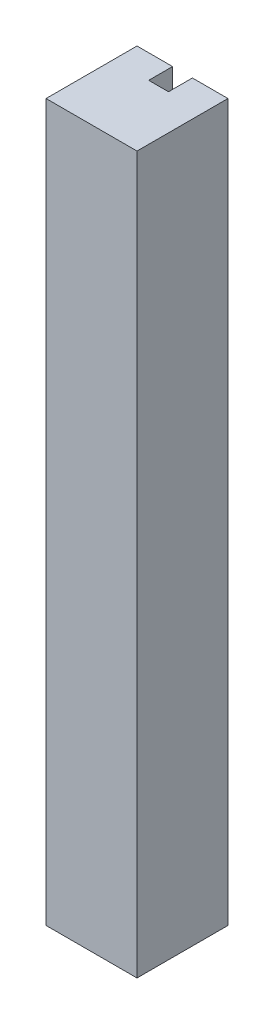
ISO-10303-21;
HEADER;
FILE_DESCRIPTION(('STEP AP214'),'2;1');
FILE_NAME('part.step','',(''),(''),'','','');
FILE_SCHEMA(('AUTOMOTIVE_DESIGN { 1 0 10303 214 1 1 1 1 }'));
ENDSEC;
DATA;
#1=APPLICATION_CONTEXT('core data for automotive mechanical design processes');
#2=APPLICATION_PROTOCOL_DEFINITION('international standard','automotive_design',2000,#1);
#3=PRODUCT_CONTEXT('',#1,'mechanical');
#4=PRODUCT('Part','Part','',(#3));
#5=PRODUCT_RELATED_PRODUCT_CATEGORY('part','',(#4));
#6=PRODUCT_DEFINITION_FORMATION('','',#4);
#7=PRODUCT_DEFINITION_CONTEXT('part definition',#1,'design');
#8=PRODUCT_DEFINITION('design','',#6,#7);
#9=PRODUCT_DEFINITION_SHAPE('','',#8);
#10=(LENGTH_UNIT() NAMED_UNIT(*) SI_UNIT(.MILLI.,.METRE.));
#11=(NAMED_UNIT(*) PLANE_ANGLE_UNIT() SI_UNIT($,.RADIAN.));
#12=(NAMED_UNIT(*) SI_UNIT($,.STERADIAN.) SOLID_ANGLE_UNIT());
#13=UNCERTAINTY_MEASURE_WITH_UNIT(LENGTH_MEASURE(1.E-05),#10,'distance_accuracy_value','');
#14=(GEOMETRIC_REPRESENTATION_CONTEXT(3) GLOBAL_UNCERTAINTY_ASSIGNED_CONTEXT((#13)) GLOBAL_UNIT_ASSIGNED_CONTEXT((#10,
#11,#12)) REPRESENTATION_CONTEXT('',''));
#15=CARTESIAN_POINT('',(0.,0.,0.));
#16=DIRECTION('',(0.,0.,1.));
#17=DIRECTION('',(1.,0.,0.));
#18=AXIS2_PLACEMENT_3D('',#15,#16,#17);
#19=CARTESIAN_POINT('',(38.1,300.,0.));
#20=DIRECTION('',(0.,0.,-1.));
#21=DIRECTION('',(-1.,0.,0.));
#22=AXIS2_PLACEMENT_3D('',#19,#20,#21);
#23=PLANE('',#22);
#24=DIRECTION('',(1.,0.,0.));
#25=VECTOR('',#24,1.);
#26=CARTESIAN_POINT('',(38.1,0.,0.));
#27=LINE('',#26,#25);
#28=CARTESIAN_POINT('',(0.,0.,0.));
#29=VERTEX_POINT('',#28);
#30=CARTESIAN_POINT('',(38.1,0.,0.));
#31=VERTEX_POINT('',#30);
#32=EDGE_CURVE('E134',#29,#31,#27,.T.);
#33=ORIENTED_EDGE('',*,*,#32,.T.);
#34=DIRECTION('',(0.,-1.,0.));
#35=VECTOR('',#34,1.);
#36=CARTESIAN_POINT('',(38.1,300.,0.));
#37=LINE('',#36,#35);
#38=CARTESIAN_POINT('',(38.1,300.,0.));
#39=VERTEX_POINT('',#38);
#40=EDGE_CURVE('E11',#39,#31,#37,.T.);
#41=ORIENTED_EDGE('',*,*,#40,.F.);
#42=DIRECTION('',(1.,0.,0.));
#43=VECTOR('',#42,1.);
#44=CARTESIAN_POINT('',(38.1,300.,0.));
#45=LINE('',#44,#43);
#46=CARTESIAN_POINT('',(0.,300.,0.));
#47=VERTEX_POINT('',#46);
#48=EDGE_CURVE('E148',#47,#39,#45,.T.);
#49=ORIENTED_EDGE('',*,*,#48,.F.);
#50=DIRECTION('',(0.,-1.,0.));
#51=VECTOR('',#50,1.);
#52=CARTESIAN_POINT('',(0.,300.,0.));
#53=LINE('',#52,#51);
#54=EDGE_CURVE('E130',#47,#29,#53,.T.);
#55=ORIENTED_EDGE('',*,*,#54,.T.);
#56=EDGE_LOOP('',(#33,#41,#49,#55));
#57=FACE_BOUND('',#56,.T.);
#58=ADVANCED_FACE('F38',(#57),#23,.F.);
#59=CARTESIAN_POINT('',(38.1,300.,-38.1));
#60=DIRECTION('',(-1.,0.,0.));
#61=DIRECTION('',(0.,0.,1.));
#62=AXIS2_PLACEMENT_3D('',#59,#60,#61);
#63=PLANE('',#62);
#64=DIRECTION('',(0.,0.,-1.));
#65=VECTOR('',#64,1.);
#66=CARTESIAN_POINT('',(38.1,0.,-38.1));
#67=LINE('',#66,#65);
#68=CARTESIAN_POINT('',(38.1,0.,-38.1));
#69=VERTEX_POINT('',#68);
#70=EDGE_CURVE('E137',#31,#69,#67,.T.);
#71=ORIENTED_EDGE('',*,*,#70,.T.);
#72=DIRECTION('',(0.,-1.,0.));
#73=VECTOR('',#72,1.);
#74=CARTESIAN_POINT('',(38.1,300.,-38.1));
#75=LINE('',#74,#73);
#76=CARTESIAN_POINT('',(38.1,300.,-38.1));
#77=VERTEX_POINT('',#76);
#78=EDGE_CURVE('E46',#77,#69,#75,.T.);
#79=ORIENTED_EDGE('',*,*,#78,.F.);
#80=DIRECTION('',(0.,0.,-1.));
#81=VECTOR('',#80,1.);
#82=CARTESIAN_POINT('',(38.1,300.,-38.1));
#83=LINE('',#82,#81);
#84=EDGE_CURVE('E97',#39,#77,#83,.T.);
#85=ORIENTED_EDGE('',*,*,#84,.F.);
#86=ORIENTED_EDGE('',*,*,#40,.T.);
#87=EDGE_LOOP('',(#71,#79,#85,#86));
#88=FACE_BOUND('',#87,.T.);
#89=ADVANCED_FACE('F183',(#88),#63,.F.);
#90=CARTESIAN_POINT('',(23.2,300.,-38.1));
#91=DIRECTION('',(0.,0.,1.));
#92=DIRECTION('',(1.,0.,0.));
#93=AXIS2_PLACEMENT_3D('',#90,#91,#92);
#94=PLANE('',#93);
#95=DIRECTION('',(-1.,0.,0.));
#96=VECTOR('',#95,1.);
#97=CARTESIAN_POINT('',(23.2,0.,-38.1));
#98=LINE('',#97,#96);
#99=CARTESIAN_POINT('',(23.2,0.,-38.1));
#100=VERTEX_POINT('',#99);
#101=EDGE_CURVE('E139',#69,#100,#98,.T.);
#102=ORIENTED_EDGE('',*,*,#101,.T.);
#103=DIRECTION('',(0.,-1.,0.));
#104=VECTOR('',#103,1.);
#105=CARTESIAN_POINT('',(23.2,300.,-38.1));
#106=LINE('',#105,#104);
#107=CARTESIAN_POINT('',(23.2,300.,-38.1));
#108=VERTEX_POINT('',#107);
#109=EDGE_CURVE('E155',#108,#100,#106,.T.);
#110=ORIENTED_EDGE('',*,*,#109,.F.);
#111=DIRECTION('',(-1.,0.,0.));
#112=VECTOR('',#111,1.);
#113=CARTESIAN_POINT('',(23.2,300.,-38.1));
#114=LINE('',#113,#112);
#115=EDGE_CURVE('E163',#77,#108,#114,.T.);
#116=ORIENTED_EDGE('',*,*,#115,.F.);
#117=ORIENTED_EDGE('',*,*,#78,.T.);
#118=EDGE_LOOP('',(#102,#110,#116,#117));
#119=FACE_BOUND('',#118,.T.);
#120=ADVANCED_FACE('F161',(#119),#94,.F.);
#121=CARTESIAN_POINT('',(23.2,300.,-28.1));
#122=DIRECTION('',(1.,0.,0.));
#123=DIRECTION('',(0.,0.,-1.));
#124=AXIS2_PLACEMENT_3D('',#121,#122,#123);
#125=PLANE('',#124);
#126=DIRECTION('',(0.,0.,1.));
#127=VECTOR('',#126,1.);
#128=CARTESIAN_POINT('',(23.2,0.,-28.1));
#129=LINE('',#128,#127);
#130=CARTESIAN_POINT('',(23.2,0.,-28.1));
#131=VERTEX_POINT('',#130);
#132=EDGE_CURVE('E141',#100,#131,#129,.T.);
#133=ORIENTED_EDGE('',*,*,#132,.T.);
#134=DIRECTION('',(0.,-1.,0.));
#135=VECTOR('',#134,1.);
#136=CARTESIAN_POINT('',(23.2,300.,-28.1));
#137=LINE('',#136,#135);
#138=CARTESIAN_POINT('',(23.2,300.,-28.1));
#139=VERTEX_POINT('',#138);
#140=EDGE_CURVE('E152',#139,#131,#137,.T.);
#141=ORIENTED_EDGE('',*,*,#140,.F.);
#142=DIRECTION('',(0.,0.,1.));
#143=VECTOR('',#142,1.);
#144=CARTESIAN_POINT('',(23.2,300.,-28.1));
#145=LINE('',#144,#143);
#146=EDGE_CURVE('E175',#108,#139,#145,.T.);
#147=ORIENTED_EDGE('',*,*,#146,.F.);
#148=ORIENTED_EDGE('',*,*,#109,.T.);
#149=EDGE_LOOP('',(#133,#141,#147,#148));
#150=FACE_BOUND('',#149,.T.);
#151=ADVANCED_FACE('F171',(#150),#125,.F.);
#152=CARTESIAN_POINT('',(14.9,300.,-28.1));
#153=DIRECTION('',(0.,0.,1.));
#154=DIRECTION('',(1.,0.,0.));
#155=AXIS2_PLACEMENT_3D('',#152,#153,#154);
#156=PLANE('',#155);
#157=DIRECTION('',(-1.,0.,0.));
#158=VECTOR('',#157,1.);
#159=CARTESIAN_POINT('',(14.9,0.,-28.1));
#160=LINE('',#159,#158);
#161=CARTESIAN_POINT('',(14.9,0.,-28.1));
#162=VERTEX_POINT('',#161);
#163=EDGE_CURVE('E143',#131,#162,#160,.T.);
#164=ORIENTED_EDGE('',*,*,#163,.T.);
#165=DIRECTION('',(0.,-1.,0.));
#166=VECTOR('',#165,1.);
#167=CARTESIAN_POINT('',(14.9,300.,-28.1));
#168=LINE('',#167,#166);
#169=CARTESIAN_POINT('',(14.9,300.,-28.1));
#170=VERTEX_POINT('',#169);
#171=EDGE_CURVE('E125',#170,#162,#168,.T.);
#172=ORIENTED_EDGE('',*,*,#171,.F.);
#173=DIRECTION('',(-1.,0.,0.));
#174=VECTOR('',#173,1.);
#175=CARTESIAN_POINT('',(14.9,300.,-28.1));
#176=LINE('',#175,#174);
#177=EDGE_CURVE('E116',#139,#170,#176,.T.);
#178=ORIENTED_EDGE('',*,*,#177,.F.);
#179=ORIENTED_EDGE('',*,*,#140,.T.);
#180=EDGE_LOOP('',(#164,#172,#178,#179));
#181=FACE_BOUND('',#180,.T.);
#182=ADVANCED_FACE('F174',(#181),#156,.F.);
#183=CARTESIAN_POINT('',(14.9,300.,-38.1));
#184=DIRECTION('',(-1.,0.,0.));
#185=DIRECTION('',(0.,0.,1.));
#186=AXIS2_PLACEMENT_3D('',#183,#184,#185);
#187=PLANE('',#186);
#188=DIRECTION('',(0.,0.,-1.));
#189=VECTOR('',#188,1.);
#190=CARTESIAN_POINT('',(14.9,0.,-38.1));
#191=LINE('',#190,#189);
#192=CARTESIAN_POINT('',(14.9,0.,-38.1));
#193=VERTEX_POINT('',#192);
#194=EDGE_CURVE('E124',#162,#193,#191,.T.);
#195=ORIENTED_EDGE('',*,*,#194,.T.);
#196=DIRECTION('',(0.,-1.,0.));
#197=VECTOR('',#196,1.);
#198=CARTESIAN_POINT('',(14.9,300.,-38.1));
#199=LINE('',#198,#197);
#200=CARTESIAN_POINT('',(14.9,300.,-38.1));
#201=VERTEX_POINT('',#200);
#202=EDGE_CURVE('E121',#201,#193,#199,.T.);
#203=ORIENTED_EDGE('',*,*,#202,.F.);
#204=DIRECTION('',(0.,0.,-1.));
#205=VECTOR('',#204,1.);
#206=CARTESIAN_POINT('',(14.9,300.,-38.1));
#207=LINE('',#206,#205);
#208=EDGE_CURVE('E110',#170,#201,#207,.T.);
#209=ORIENTED_EDGE('',*,*,#208,.F.);
#210=ORIENTED_EDGE('',*,*,#171,.T.);
#211=EDGE_LOOP('',(#195,#203,#209,#210));
#212=FACE_BOUND('',#211,.T.);
#213=ADVANCED_FACE('F122',(#212),#187,.F.);
#214=CARTESIAN_POINT('',(0.,300.,-38.1));
#215=DIRECTION('',(0.,0.,1.));
#216=DIRECTION('',(1.,0.,0.));
#217=AXIS2_PLACEMENT_3D('',#214,#215,#216);
#218=PLANE('',#217);
#219=DIRECTION('',(-1.,0.,0.));
#220=VECTOR('',#219,1.);
#221=CARTESIAN_POINT('',(0.,0.,-38.1));
#222=LINE('',#221,#220);
#223=CARTESIAN_POINT('',(0.,0.,-38.1));
#224=VERTEX_POINT('',#223);
#225=EDGE_CURVE('E83',#193,#224,#222,.T.);
#226=ORIENTED_EDGE('',*,*,#225,.T.);
#227=DIRECTION('',(0.,-1.,0.));
#228=VECTOR('',#227,1.);
#229=CARTESIAN_POINT('',(0.,300.,-38.1));
#230=LINE('',#229,#228);
#231=CARTESIAN_POINT('',(0.,300.,-38.1));
#232=VERTEX_POINT('',#231);
#233=EDGE_CURVE('E126',#232,#224,#230,.T.);
#234=ORIENTED_EDGE('',*,*,#233,.F.);
#235=DIRECTION('',(-1.,0.,0.));
#236=VECTOR('',#235,1.);
#237=CARTESIAN_POINT('',(0.,300.,-38.1));
#238=LINE('',#237,#236);
#239=EDGE_CURVE('E114',#201,#232,#238,.T.);
#240=ORIENTED_EDGE('',*,*,#239,.F.);
#241=ORIENTED_EDGE('',*,*,#202,.T.);
#242=EDGE_LOOP('',(#226,#234,#240,#241));
#243=FACE_BOUND('',#242,.T.);
#244=ADVANCED_FACE('F128',(#243),#218,.F.);
#245=CARTESIAN_POINT('',(0.,300.,0.));
#246=DIRECTION('',(1.,0.,0.));
#247=DIRECTION('',(0.,0.,-1.));
#248=AXIS2_PLACEMENT_3D('',#245,#246,#247);
#249=PLANE('',#248);
#250=DIRECTION('',(0.,0.,1.));
#251=VECTOR('',#250,1.);
#252=CARTESIAN_POINT('',(0.,0.,0.));
#253=LINE('',#252,#251);
#254=EDGE_CURVE('E89',#224,#29,#253,.T.);
#255=ORIENTED_EDGE('',*,*,#254,.T.);
#256=ORIENTED_EDGE('',*,*,#54,.F.);
#257=DIRECTION('',(0.,0.,1.));
#258=VECTOR('',#257,1.);
#259=CARTESIAN_POINT('',(0.,300.,0.));
#260=LINE('',#259,#258);
#261=EDGE_CURVE('E54',#232,#47,#260,.T.);
#262=ORIENTED_EDGE('',*,*,#261,.F.);
#263=ORIENTED_EDGE('',*,*,#233,.T.);
#264=EDGE_LOOP('',(#255,#256,#262,#263));
#265=FACE_BOUND('',#264,.T.);
#266=ADVANCED_FACE('F199',(#265),#249,.F.);
#267=CARTESIAN_POINT('',(0.,300.,0.));
#268=DIRECTION('',(0.,-1.,0.));
#269=DIRECTION('',(0.,0.,-1.));
#270=AXIS2_PLACEMENT_3D('',#267,#268,#269);
#271=PLANE('',#270);
#272=ORIENTED_EDGE('',*,*,#48,.T.);
#273=ORIENTED_EDGE('',*,*,#84,.T.);
#274=ORIENTED_EDGE('',*,*,#115,.T.);
#275=ORIENTED_EDGE('',*,*,#146,.T.);
#276=ORIENTED_EDGE('',*,*,#177,.T.);
#277=ORIENTED_EDGE('',*,*,#208,.T.);
#278=ORIENTED_EDGE('',*,*,#239,.T.);
#279=ORIENTED_EDGE('',*,*,#261,.T.);
#280=EDGE_LOOP('',(#272,#273,#274,#275,#276,#277,#278,#279));
#281=FACE_BOUND('',#280,.T.);
#282=ADVANCED_FACE('F112',(#281),#271,.F.);
#283=CARTESIAN_POINT('',(0.,0.,0.));
#284=DIRECTION('',(0.,-1.,0.));
#285=DIRECTION('',(0.,0.,-1.));
#286=AXIS2_PLACEMENT_3D('',#283,#284,#285);
#287=PLANE('',#286);
#288=ORIENTED_EDGE('',*,*,#32,.F.);
#289=ORIENTED_EDGE('',*,*,#254,.F.);
#290=ORIENTED_EDGE('',*,*,#225,.F.);
#291=ORIENTED_EDGE('',*,*,#194,.F.);
#292=ORIENTED_EDGE('',*,*,#163,.F.);
#293=ORIENTED_EDGE('',*,*,#132,.F.);
#294=ORIENTED_EDGE('',*,*,#101,.F.);
#295=ORIENTED_EDGE('',*,*,#70,.F.);
#296=EDGE_LOOP('',(#288,#289,#290,#291,#292,#293,#294,#295));
#297=FACE_BOUND('',#296,.T.);
#298=ADVANCED_FACE('F167',(#297),#287,.T.);
#299=CLOSED_SHELL('',(#58,#89,#120,#151,#182,#213,#244,#266,#282,#298));
#300=MANIFOLD_SOLID_BREP('B2',#299);
#301=ADVANCED_BREP_SHAPE_REPRESENTATION('',(#18,#300),#14);
#302=SHAPE_DEFINITION_REPRESENTATION(#9,#301);
ENDSEC;
END-ISO-10303-21;
